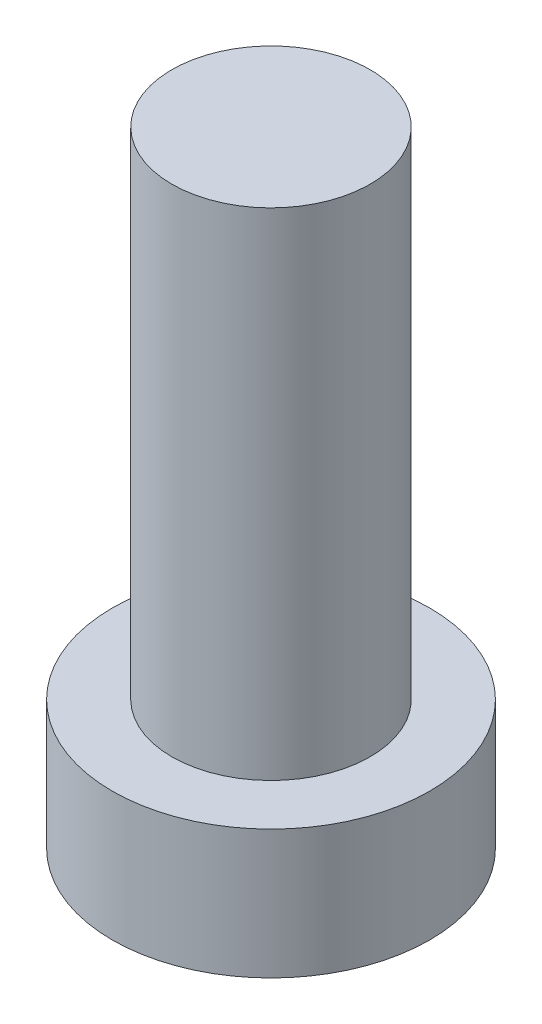
ISO-10303-21;
HEADER;
FILE_DESCRIPTION(('STEP AP214'),'2;1');
FILE_NAME('part.step','',(''),(''),'','','');
FILE_SCHEMA(('AUTOMOTIVE_DESIGN { 1 0 10303 214 1 1 1 1 }'));
ENDSEC;
DATA;
#1=APPLICATION_CONTEXT('core data for automotive mechanical design processes');
#2=APPLICATION_PROTOCOL_DEFINITION('international standard','automotive_design',2000,#1);
#3=PRODUCT_CONTEXT('',#1,'mechanical');
#4=PRODUCT('Part','Part','',(#3));
#5=PRODUCT_RELATED_PRODUCT_CATEGORY('part','',(#4));
#6=PRODUCT_DEFINITION_FORMATION('','',#4);
#7=PRODUCT_DEFINITION_CONTEXT('part definition',#1,'design');
#8=PRODUCT_DEFINITION('design','',#6,#7);
#9=PRODUCT_DEFINITION_SHAPE('','',#8);
#10=(LENGTH_UNIT() NAMED_UNIT(*) SI_UNIT(.MILLI.,.METRE.));
#11=(NAMED_UNIT(*) PLANE_ANGLE_UNIT() SI_UNIT($,.RADIAN.));
#12=(NAMED_UNIT(*) SI_UNIT($,.STERADIAN.) SOLID_ANGLE_UNIT());
#13=UNCERTAINTY_MEASURE_WITH_UNIT(LENGTH_MEASURE(1.E-05),#10,'distance_accuracy_value','');
#14=(GEOMETRIC_REPRESENTATION_CONTEXT(3) GLOBAL_UNCERTAINTY_ASSIGNED_CONTEXT((#13)) GLOBAL_UNIT_ASSIGNED_CONTEXT((#10,
#11,#12)) REPRESENTATION_CONTEXT('',''));
#15=CARTESIAN_POINT('',(0.,0.,0.));
#16=DIRECTION('',(0.,0.,1.));
#17=DIRECTION('',(1.,0.,0.));
#18=AXIS2_PLACEMENT_3D('',#15,#16,#17);
#19=CARTESIAN_POINT('',(1.70002900645727E-13,1.3,0.));
#20=DIRECTION('',(0.,-1.00000000000001,0.));
#21=DIRECTION('',(0.,0.,-0.999999999999994));
#22=AXIS2_PLACEMENT_3D('',#19,#20,#21);
#23=CYLINDRICAL_SURFACE('',#22,1.6);
#24=CARTESIAN_POINT('',(1.70002900645727E-13,1.3,0.));
#25=DIRECTION('',(0.,1.00000000000001,0.));
#26=DIRECTION('',(0.,0.,0.999999999999994));
#27=AXIS2_PLACEMENT_3D('',#24,#25,#26);
#28=CIRCLE('',#27,1.6);
#29=CARTESIAN_POINT('',(1.69292357909967E-13,1.3,1.59999999999995));
#30=VERTEX_POINT('',#29);
#31=EDGE_CURVE('E47',#30,#30,#28,.T.);
#32=ORIENTED_EDGE('',*,*,#31,.F.);
#33=EDGE_LOOP('',(#32));
#34=FACE_BOUND('',#33,.T.);
#35=CARTESIAN_POINT('',(0.,0.,0.));
#36=DIRECTION('',(0.,1.00000000000001,0.));
#37=DIRECTION('',(0.,0.,0.999999999999994));
#38=AXIS2_PLACEMENT_3D('',#35,#36,#37);
#39=CIRCLE('',#38,1.6);
#40=CARTESIAN_POINT('',(0.,0.,1.59999999999999));
#41=VERTEX_POINT('',#40);
#42=EDGE_CURVE('E42',#41,#41,#39,.T.);
#43=ORIENTED_EDGE('',*,*,#42,.T.);
#44=EDGE_LOOP('',(#43));
#45=FACE_BOUND('',#44,.T.);
#46=ADVANCED_FACE('F39',(#34,#45),#23,.T.);
#47=CARTESIAN_POINT('',(1.70002900645727E-13,1.3,0.));
#48=DIRECTION('',(0.,1.00000000000001,0.));
#49=DIRECTION('',(0.,0.,0.999999999999994));
#50=AXIS2_PLACEMENT_3D('',#47,#48,#49);
#51=PLANE('',#50);
#52=CARTESIAN_POINT('',(1.70002900645727E-13,1.3,0.));
#53=DIRECTION('',(0.,1.00000000000001,0.));
#54=DIRECTION('',(0.,0.,0.999999999999994));
#55=AXIS2_PLACEMENT_3D('',#52,#53,#54);
#56=CIRCLE('',#55,1.);
#57=CARTESIAN_POINT('',(1.69558811435877E-13,1.3,0.999999999999953));
#58=VERTEX_POINT('',#57);
#59=EDGE_CURVE('E10',#58,#58,#56,.T.);
#60=ORIENTED_EDGE('',*,*,#59,.F.);
#61=EDGE_LOOP('',(#60));
#62=FACE_BOUND('',#61,.T.);
#63=ORIENTED_EDGE('',*,*,#31,.T.);
#64=EDGE_LOOP('',(#63));
#65=FACE_BOUND('',#64,.T.);
#66=ADVANCED_FACE('F67',(#62,#65),#51,.T.);
#67=CARTESIAN_POINT('',(0.,0.,0.));
#68=DIRECTION('',(0.,1.00000000000001,0.));
#69=DIRECTION('',(0.,0.,0.999999999999994));
#70=AXIS2_PLACEMENT_3D('',#67,#68,#69);
#71=PLANE('',#70);
#72=ORIENTED_EDGE('',*,*,#42,.F.);
#73=EDGE_LOOP('',(#72));
#74=FACE_BOUND('',#73,.T.);
#75=ADVANCED_FACE('F64',(#74),#71,.F.);
#76=CARTESIAN_POINT('',(0.,6.3,0.));
#77=DIRECTION('',(0.,-1.00000000000001,0.));
#78=DIRECTION('',(0.,0.,-0.999999999999994));
#79=AXIS2_PLACEMENT_3D('',#76,#77,#78);
#80=CYLINDRICAL_SURFACE('',#79,1.);
#81=CARTESIAN_POINT('',(0.,6.3,0.));
#82=DIRECTION('',(0.,1.00000000000001,0.));
#83=DIRECTION('',(0.,0.,0.999999999999994));
#84=AXIS2_PLACEMENT_3D('',#81,#82,#83);
#85=CIRCLE('',#84,1.);
#86=CARTESIAN_POINT('',(0.,6.3,1.00000000000006));
#87=VERTEX_POINT('',#86);
#88=EDGE_CURVE('E54',#87,#87,#85,.T.);
#89=ORIENTED_EDGE('',*,*,#88,.F.);
#90=EDGE_LOOP('',(#89));
#91=FACE_BOUND('',#90,.T.);
#92=ORIENTED_EDGE('',*,*,#59,.T.);
#93=EDGE_LOOP('',(#92));
#94=FACE_BOUND('',#93,.T.);
#95=ADVANCED_FACE('F66',(#91,#94),#80,.T.);
#96=CARTESIAN_POINT('',(0.,6.3,0.));
#97=DIRECTION('',(0.,1.00000000000001,0.));
#98=DIRECTION('',(0.,0.,0.999999999999994));
#99=AXIS2_PLACEMENT_3D('',#96,#97,#98);
#100=PLANE('',#99);
#101=ORIENTED_EDGE('',*,*,#88,.T.);
#102=EDGE_LOOP('',(#101));
#103=FACE_BOUND('',#102,.T.);
#104=ADVANCED_FACE('F72',(#103),#100,.T.);
#105=CLOSED_SHELL('',(#46,#66,#75,#95,#104));
#106=MANIFOLD_SOLID_BREP('B2',#105);
#107=ADVANCED_BREP_SHAPE_REPRESENTATION('',(#18,#106),#14);
#108=SHAPE_DEFINITION_REPRESENTATION(#9,#107);
ENDSEC;
END-ISO-10303-21;
